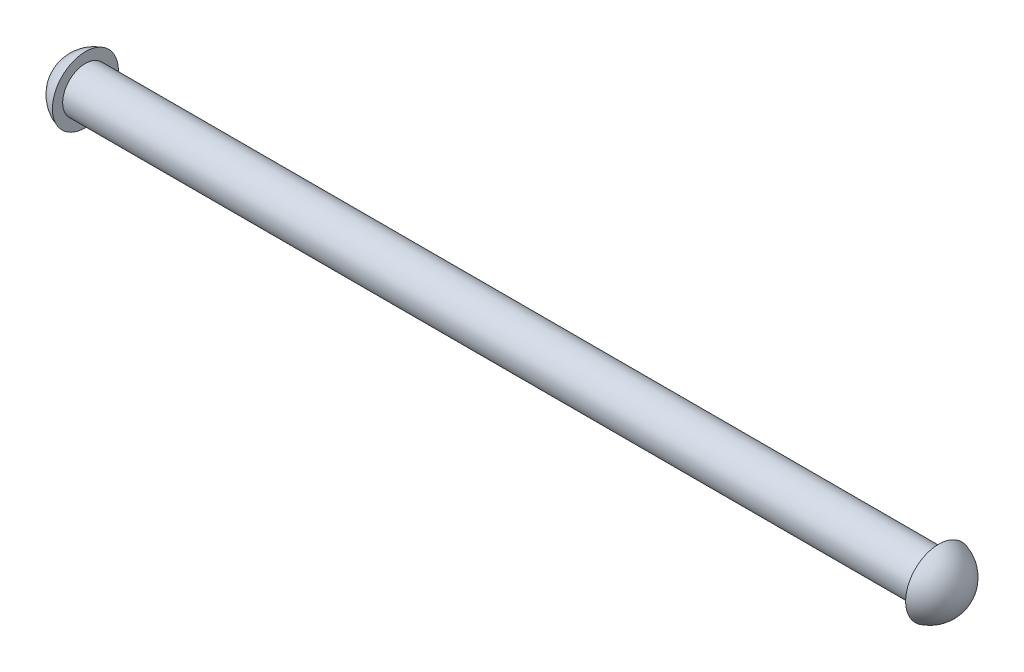
ISO-10303-21;
HEADER;
FILE_DESCRIPTION(('STEP AP214'),'2;1');
FILE_NAME('part.step','',(''),(''),'','','');
FILE_SCHEMA(('AUTOMOTIVE_DESIGN { 1 0 10303 214 1 1 1 1 }'));
ENDSEC;
DATA;
#1=APPLICATION_CONTEXT('core data for automotive mechanical design processes');
#2=APPLICATION_PROTOCOL_DEFINITION('international standard','automotive_design',2000,#1);
#3=PRODUCT_CONTEXT('',#1,'mechanical');
#4=PRODUCT('Part','Part','',(#3));
#5=PRODUCT_RELATED_PRODUCT_CATEGORY('part','',(#4));
#6=PRODUCT_DEFINITION_FORMATION('','',#4);
#7=PRODUCT_DEFINITION_CONTEXT('part definition',#1,'design');
#8=PRODUCT_DEFINITION('design','',#6,#7);
#9=PRODUCT_DEFINITION_SHAPE('','',#8);
#10=(LENGTH_UNIT() NAMED_UNIT(*) SI_UNIT(.MILLI.,.METRE.));
#11=(NAMED_UNIT(*) PLANE_ANGLE_UNIT() SI_UNIT($,.RADIAN.));
#12=(NAMED_UNIT(*) SI_UNIT($,.STERADIAN.) SOLID_ANGLE_UNIT());
#13=UNCERTAINTY_MEASURE_WITH_UNIT(LENGTH_MEASURE(1.E-05),#10,'distance_accuracy_value','');
#14=(GEOMETRIC_REPRESENTATION_CONTEXT(3) GLOBAL_UNCERTAINTY_ASSIGNED_CONTEXT((#13)) GLOBAL_UNIT_ASSIGNED_CONTEXT((#10,
#11,#12)) REPRESENTATION_CONTEXT('',''));
#15=CARTESIAN_POINT('',(0.,0.,0.));
#16=DIRECTION('',(0.,0.,1.));
#17=DIRECTION('',(1.,0.,0.));
#18=AXIS2_PLACEMENT_3D('',#15,#16,#17);
#19=CARTESIAN_POINT('',(-36.7318854252131,0.,0.));
#20=DIRECTION('',(-1.,0.,0.));
#21=DIRECTION('',(0.,1.,0.));
#22=AXIS2_PLACEMENT_3D('',#19,#20,#21);
#23=SPHERICAL_SURFACE('',#22,3.);
#24=CARTESIAN_POINT('',(-37.5,0.,0.));
#25=DIRECTION('',(-1.,0.,0.));
#26=DIRECTION('',(0.,0.,1.));
#27=AXIS2_PLACEMENT_3D('',#24,#25,#26);
#28=CIRCLE('',#27,2.9);
#29=CARTESIAN_POINT('',(-37.5,0.,2.9));
#30=VERTEX_POINT('',#29);
#31=EDGE_CURVE('E46',#30,#30,#28,.T.);
#32=ORIENTED_EDGE('',*,*,#31,.T.);
#33=EDGE_LOOP('',(#32));
#34=FACE_BOUND('',#33,.T.);
#35=ADVANCED_FACE('F32',(#34),#23,.T.);
#36=CARTESIAN_POINT('',(36.7318854252131,0.,0.));
#37=DIRECTION('',(-1.,0.,0.));
#38=DIRECTION('',(0.,-1.,0.));
#39=AXIS2_PLACEMENT_3D('',#36,#37,#38);
#40=SPHERICAL_SURFACE('',#39,3.);
#41=CARTESIAN_POINT('',(37.5,0.,0.));
#42=DIRECTION('',(-1.,0.,0.));
#43=DIRECTION('',(0.,0.,1.));
#44=AXIS2_PLACEMENT_3D('',#41,#42,#43);
#45=CIRCLE('',#44,2.9);
#46=CARTESIAN_POINT('',(37.5,0.,2.9));
#47=VERTEX_POINT('',#46);
#48=EDGE_CURVE('E10',#47,#47,#45,.T.);
#49=ORIENTED_EDGE('',*,*,#48,.F.);
#50=EDGE_LOOP('',(#49));
#51=FACE_BOUND('',#50,.T.);
#52=ADVANCED_FACE('F66',(#51),#40,.T.);
#53=CARTESIAN_POINT('',(37.5,2.,0.));
#54=DIRECTION('',(1.,0.,0.));
#55=DIRECTION('',(0.,0.,-1.));
#56=AXIS2_PLACEMENT_3D('',#53,#54,#55);
#57=PLANE('',#56);
#58=CARTESIAN_POINT('',(37.5,0.,0.));
#59=DIRECTION('',(-1.,0.,0.));
#60=DIRECTION('',(0.,0.,1.));
#61=AXIS2_PLACEMENT_3D('',#58,#59,#60);
#62=CIRCLE('',#61,2.);
#63=CARTESIAN_POINT('',(37.5,0.,2.));
#64=VERTEX_POINT('',#63);
#65=EDGE_CURVE('E38',#64,#64,#62,.T.);
#66=ORIENTED_EDGE('',*,*,#65,.F.);
#67=EDGE_LOOP('',(#66));
#68=FACE_BOUND('',#67,.T.);
#69=ORIENTED_EDGE('',*,*,#48,.T.);
#70=EDGE_LOOP('',(#69));
#71=FACE_BOUND('',#70,.T.);
#72=ADVANCED_FACE('F61',(#68,#71),#57,.F.);
#73=CARTESIAN_POINT('',(-37.5,0.,0.));
#74=DIRECTION('',(-1.,0.,0.));
#75=DIRECTION('',(0.,0.,1.));
#76=AXIS2_PLACEMENT_3D('',#73,#74,#75);
#77=CYLINDRICAL_SURFACE('',#76,2.);
#78=CARTESIAN_POINT('',(-37.5,0.,0.));
#79=DIRECTION('',(-1.,0.,0.));
#80=DIRECTION('',(0.,0.,1.));
#81=AXIS2_PLACEMENT_3D('',#78,#79,#80);
#82=CIRCLE('',#81,2.);
#83=CARTESIAN_POINT('',(-37.5,0.,2.));
#84=VERTEX_POINT('',#83);
#85=EDGE_CURVE('E42',#84,#84,#82,.T.);
#86=ORIENTED_EDGE('',*,*,#85,.F.);
#87=EDGE_LOOP('',(#86));
#88=FACE_BOUND('',#87,.T.);
#89=ORIENTED_EDGE('',*,*,#65,.T.);
#90=EDGE_LOOP('',(#89));
#91=FACE_BOUND('',#90,.T.);
#92=ADVANCED_FACE('F56',(#88,#91),#77,.T.);
#93=CARTESIAN_POINT('',(-37.5,2.,0.));
#94=DIRECTION('',(-1.,0.,0.));
#95=DIRECTION('',(0.,0.,1.));
#96=AXIS2_PLACEMENT_3D('',#93,#94,#95);
#97=PLANE('',#96);
#98=ORIENTED_EDGE('',*,*,#31,.F.);
#99=EDGE_LOOP('',(#98));
#100=FACE_BOUND('',#99,.T.);
#101=ORIENTED_EDGE('',*,*,#85,.T.);
#102=EDGE_LOOP('',(#101));
#103=FACE_BOUND('',#102,.T.);
#104=ADVANCED_FACE('F53',(#100,#103),#97,.F.);
#105=CLOSED_SHELL('',(#35,#52,#72,#92,#104));
#106=MANIFOLD_SOLID_BREP('B2',#105);
#107=ADVANCED_BREP_SHAPE_REPRESENTATION('',(#18,#106),#14);
#108=SHAPE_DEFINITION_REPRESENTATION(#9,#107);
ENDSEC;
END-ISO-10303-21;
